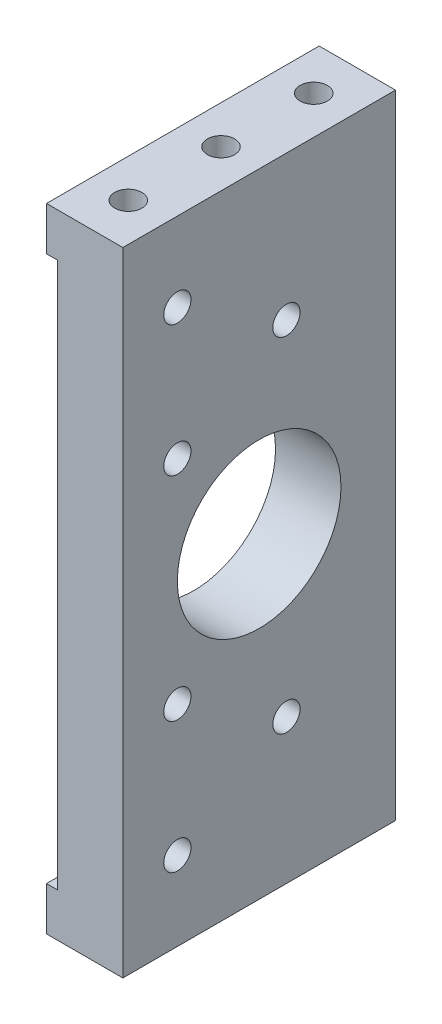
ISO-10303-21;
HEADER;
FILE_DESCRIPTION(('STEP AP214'),'2;1');
FILE_NAME('part.step','',(''),(''),'','','');
FILE_SCHEMA(('AUTOMOTIVE_DESIGN { 1 0 10303 214 1 1 1 1 }'));
ENDSEC;
DATA;
#1=APPLICATION_CONTEXT('core data for automotive mechanical design processes');
#2=APPLICATION_PROTOCOL_DEFINITION('international standard','automotive_design',2000,#1);
#3=PRODUCT_CONTEXT('',#1,'mechanical');
#4=PRODUCT('Part','Part','',(#3));
#5=PRODUCT_RELATED_PRODUCT_CATEGORY('part','',(#4));
#6=PRODUCT_DEFINITION_FORMATION('','',#4);
#7=PRODUCT_DEFINITION_CONTEXT('part definition',#1,'design');
#8=PRODUCT_DEFINITION('design','',#6,#7);
#9=PRODUCT_DEFINITION_SHAPE('','',#8);
#10=(LENGTH_UNIT() NAMED_UNIT(*) SI_UNIT(.MILLI.,.METRE.));
#11=(NAMED_UNIT(*) PLANE_ANGLE_UNIT() SI_UNIT($,.RADIAN.));
#12=(NAMED_UNIT(*) SI_UNIT($,.STERADIAN.) SOLID_ANGLE_UNIT());
#13=UNCERTAINTY_MEASURE_WITH_UNIT(LENGTH_MEASURE(1.E-05),#10,'distance_accuracy_value','');
#14=(GEOMETRIC_REPRESENTATION_CONTEXT(3) GLOBAL_UNCERTAINTY_ASSIGNED_CONTEXT((#13)) GLOBAL_UNIT_ASSIGNED_CONTEXT((#10,
#11,#12)) REPRESENTATION_CONTEXT('',''));
#15=CARTESIAN_POINT('',(0.,0.,0.));
#16=DIRECTION('',(0.,0.,1.));
#17=DIRECTION('',(1.,0.,0.));
#18=AXIS2_PLACEMENT_3D('',#15,#16,#17);
#19=CARTESIAN_POINT('',(0.,0.,25.));
#20=DIRECTION('',(0.,0.,-1.));
#21=DIRECTION('',(-1.,0.,0.));
#22=AXIS2_PLACEMENT_3D('',#19,#20,#21);
#23=PLANE('',#22);
#24=DIRECTION('',(0.,-1.,0.));
#25=VECTOR('',#24,1.);
#26=CARTESIAN_POINT('',(-86.,-29.,25.));
#27=LINE('',#26,#25);
#28=CARTESIAN_POINT('',(-86.,-25.,25.));
#29=VERTEX_POINT('',#28);
#30=CARTESIAN_POINT('',(-86.,-29.,25.));
#31=VERTEX_POINT('',#30);
#32=EDGE_CURVE('E245',#29,#31,#27,.T.);
#33=ORIENTED_EDGE('',*,*,#32,.T.);
#34=DIRECTION('',(-1.,0.,0.));
#35=VECTOR('',#34,1.);
#36=CARTESIAN_POINT('',(-79.,-29.,25.));
#37=LINE('',#36,#35);
#38=CARTESIAN_POINT('',(-79.,-29.,25.));
#39=VERTEX_POINT('',#38);
#40=EDGE_CURVE('E196',#39,#31,#37,.T.);
#41=ORIENTED_EDGE('',*,*,#40,.F.);
#42=DIRECTION('',(0.,1.,0.));
#43=VECTOR('',#42,1.);
#44=CARTESIAN_POINT('',(-79.,-29.,25.));
#45=LINE('',#44,#43);
#46=CARTESIAN_POINT('',(-79.,29.,25.));
#47=VERTEX_POINT('',#46);
#48=EDGE_CURVE('E211',#39,#47,#45,.T.);
#49=ORIENTED_EDGE('',*,*,#48,.T.);
#50=DIRECTION('',(-1.,0.,0.));
#51=VECTOR('',#50,1.);
#52=CARTESIAN_POINT('',(-86.,29.,25.));
#53=LINE('',#52,#51);
#54=CARTESIAN_POINT('',(-86.,29.,25.));
#55=VERTEX_POINT('',#54);
#56=EDGE_CURVE('E45',#47,#55,#53,.T.);
#57=ORIENTED_EDGE('',*,*,#56,.T.);
#58=CARTESIAN_POINT('',(-86.,25.,25.));
#59=VERTEX_POINT('',#58);
#60=EDGE_CURVE('E242',#55,#59,#27,.T.);
#61=ORIENTED_EDGE('',*,*,#60,.T.);
#62=DIRECTION('',(-1.,0.,0.));
#63=VECTOR('',#62,1.);
#64=CARTESIAN_POINT('',(-86.,25.,25.));
#65=LINE('',#64,#63);
#66=CARTESIAN_POINT('',(-85.,25.,25.));
#67=VERTEX_POINT('',#66);
#68=EDGE_CURVE('E221',#67,#59,#65,.T.);
#69=ORIENTED_EDGE('',*,*,#68,.F.);
#70=DIRECTION('',(0.,1.,0.));
#71=VECTOR('',#70,1.);
#72=CARTESIAN_POINT('',(-85.,25.,25.));
#73=LINE('',#72,#71);
#74=CARTESIAN_POINT('',(-85.,-25.,25.));
#75=VERTEX_POINT('',#74);
#76=EDGE_CURVE('E229',#75,#67,#73,.T.);
#77=ORIENTED_EDGE('',*,*,#76,.F.);
#78=DIRECTION('',(1.,0.,0.));
#79=VECTOR('',#78,1.);
#80=CARTESIAN_POINT('',(-86.,-25.,25.));
#81=LINE('',#80,#79);
#82=EDGE_CURVE('E216',#29,#75,#81,.T.);
#83=ORIENTED_EDGE('',*,*,#82,.F.);
#84=EDGE_LOOP('',(#33,#41,#49,#57,#61,#69,#77,#83));
#85=FACE_BOUND('',#84,.T.);
#86=ADVANCED_FACE('F36',(#85),#23,.F.);
#87=CARTESIAN_POINT('',(0.,0.,0.));
#88=DIRECTION('',(0.,0.,-1.));
#89=DIRECTION('',(-1.,0.,0.));
#90=AXIS2_PLACEMENT_3D('',#87,#88,#89);
#91=PLANE('',#90);
#92=DIRECTION('',(1.,0.,0.));
#93=VECTOR('',#92,1.);
#94=CARTESIAN_POINT('',(0.,-29.,0.));
#95=LINE('',#94,#93);
#96=CARTESIAN_POINT('',(-86.,-29.,0.));
#97=VERTEX_POINT('',#96);
#98=CARTESIAN_POINT('',(-79.,-29.,0.));
#99=VERTEX_POINT('',#98);
#100=EDGE_CURVE('E52',#97,#99,#95,.T.);
#101=ORIENTED_EDGE('',*,*,#100,.F.);
#102=DIRECTION('',(0.,-1.,0.));
#103=VECTOR('',#102,1.);
#104=CARTESIAN_POINT('',(-86.,-29.,0.));
#105=LINE('',#104,#103);
#106=CARTESIAN_POINT('',(-86.,-25.,0.));
#107=VERTEX_POINT('',#106);
#108=EDGE_CURVE('E236',#107,#97,#105,.T.);
#109=ORIENTED_EDGE('',*,*,#108,.F.);
#110=DIRECTION('',(1.,0.,0.));
#111=VECTOR('',#110,1.);
#112=CARTESIAN_POINT('',(-86.,-25.,0.));
#113=LINE('',#112,#111);
#114=CARTESIAN_POINT('',(-85.,-25.,0.));
#115=VERTEX_POINT('',#114);
#116=EDGE_CURVE('E218',#107,#115,#113,.T.);
#117=ORIENTED_EDGE('',*,*,#116,.T.);
#118=DIRECTION('',(0.,1.,0.));
#119=VECTOR('',#118,1.);
#120=CARTESIAN_POINT('',(-85.,25.,0.));
#121=LINE('',#120,#119);
#122=CARTESIAN_POINT('',(-85.,25.,0.));
#123=VERTEX_POINT('',#122);
#124=EDGE_CURVE('E60',#115,#123,#121,.T.);
#125=ORIENTED_EDGE('',*,*,#124,.T.);
#126=DIRECTION('',(-1.,0.,0.));
#127=VECTOR('',#126,1.);
#128=CARTESIAN_POINT('',(-86.,25.,0.));
#129=LINE('',#128,#127);
#130=CARTESIAN_POINT('',(-86.,25.,0.));
#131=VERTEX_POINT('',#130);
#132=EDGE_CURVE('E223',#123,#131,#129,.T.);
#133=ORIENTED_EDGE('',*,*,#132,.T.);
#134=CARTESIAN_POINT('',(-86.,29.,0.));
#135=VERTEX_POINT('',#134);
#136=EDGE_CURVE('E247',#135,#131,#105,.T.);
#137=ORIENTED_EDGE('',*,*,#136,.F.);
#138=DIRECTION('',(-1.,0.,0.));
#139=VECTOR('',#138,1.);
#140=CARTESIAN_POINT('',(-86.,29.,0.));
#141=LINE('',#140,#139);
#142=CARTESIAN_POINT('',(-79.,29.,0.));
#143=VERTEX_POINT('',#142);
#144=EDGE_CURVE('E250',#143,#135,#141,.T.);
#145=ORIENTED_EDGE('',*,*,#144,.F.);
#146=DIRECTION('',(0.,1.,0.));
#147=VECTOR('',#146,1.);
#148=CARTESIAN_POINT('',(-79.,-29.,0.));
#149=LINE('',#148,#147);
#150=EDGE_CURVE('E214',#99,#143,#149,.T.);
#151=ORIENTED_EDGE('',*,*,#150,.F.);
#152=EDGE_LOOP('',(#101,#109,#117,#125,#133,#137,#145,#151));
#153=FACE_BOUND('',#152,.T.);
#154=ADVANCED_FACE('F268',(#153),#91,.T.);
#155=CARTESIAN_POINT('',(-86.,-29.,25.));
#156=DIRECTION('',(1.,0.,0.));
#157=DIRECTION('',(0.,0.,-1.));
#158=AXIS2_PLACEMENT_3D('',#155,#156,#157);
#159=PLANE('',#158);
#160=ORIENTED_EDGE('',*,*,#136,.T.);
#161=DIRECTION('',(0.,0.,1.));
#162=VECTOR('',#161,1.);
#163=CARTESIAN_POINT('',(-86.,25.,0.));
#164=LINE('',#163,#162);
#165=EDGE_CURVE('E233',#131,#59,#164,.T.);
#166=ORIENTED_EDGE('',*,*,#165,.T.);
#167=ORIENTED_EDGE('',*,*,#60,.F.);
#168=DIRECTION('',(0.,0.,-1.));
#169=VECTOR('',#168,1.);
#170=CARTESIAN_POINT('',(-86.,29.,25.));
#171=LINE('',#170,#169);
#172=EDGE_CURVE('E11',#55,#135,#171,.T.);
#173=ORIENTED_EDGE('',*,*,#172,.T.);
#174=EDGE_LOOP('',(#160,#166,#167,#173));
#175=FACE_BOUND('',#174,.T.);
#176=ADVANCED_FACE('F278',(#175),#159,.F.);
#177=ORIENTED_EDGE('',*,*,#108,.T.);
#178=DIRECTION('',(0.,0.,1.));
#179=VECTOR('',#178,1.);
#180=CARTESIAN_POINT('',(-86.,-29.,-35.));
#181=LINE('',#180,#179);
#182=EDGE_CURVE('E198',#97,#31,#181,.T.);
#183=ORIENTED_EDGE('',*,*,#182,.T.);
#184=ORIENTED_EDGE('',*,*,#32,.F.);
#185=DIRECTION('',(0.,0.,1.));
#186=VECTOR('',#185,1.);
#187=CARTESIAN_POINT('',(-86.,-25.,0.));
#188=LINE('',#187,#186);
#189=EDGE_CURVE('E226',#107,#29,#188,.T.);
#190=ORIENTED_EDGE('',*,*,#189,.F.);
#191=EDGE_LOOP('',(#177,#183,#184,#190));
#192=FACE_BOUND('',#191,.T.);
#193=ADVANCED_FACE('F38',(#192),#159,.F.);
#194=CARTESIAN_POINT('',(-86.,29.,25.));
#195=DIRECTION('',(0.,-1.,0.));
#196=DIRECTION('',(1.,0.,0.));
#197=AXIS2_PLACEMENT_3D('',#194,#195,#196);
#198=PLANE('',#197);
#199=CARTESIAN_POINT('',(-82.5,29.,21.));
#200=DIRECTION('',(0.,1.,0.));
#201=DIRECTION('',(0.,0.,1.));
#202=AXIS2_PLACEMENT_3D('',#199,#200,#201);
#203=CIRCLE('',#202,1.24999999999999);
#204=CARTESIAN_POINT('',(-82.5,29.,22.25));
#205=VERTEX_POINT('',#204);
#206=EDGE_CURVE('E145',#205,#205,#203,.T.);
#207=ORIENTED_EDGE('',*,*,#206,.F.);
#208=EDGE_LOOP('',(#207));
#209=FACE_BOUND('',#208,.T.);
#210=CARTESIAN_POINT('',(-82.5,29.,12.5));
#211=DIRECTION('',(0.,1.,0.));
#212=DIRECTION('',(0.,0.,1.));
#213=AXIS2_PLACEMENT_3D('',#210,#211,#212);
#214=CIRCLE('',#213,1.24999999999999);
#215=CARTESIAN_POINT('',(-82.5,29.,13.75));
#216=VERTEX_POINT('',#215);
#217=EDGE_CURVE('E151',#216,#216,#214,.T.);
#218=ORIENTED_EDGE('',*,*,#217,.F.);
#219=EDGE_LOOP('',(#218));
#220=FACE_BOUND('',#219,.T.);
#221=CARTESIAN_POINT('',(-82.5,29.,4.));
#222=DIRECTION('',(0.,1.,0.));
#223=DIRECTION('',(0.,0.,1.));
#224=AXIS2_PLACEMENT_3D('',#221,#222,#223);
#225=CIRCLE('',#224,1.24999999999999);
#226=CARTESIAN_POINT('',(-82.5,29.,5.24999999999999));
#227=VERTEX_POINT('',#226);
#228=EDGE_CURVE('E157',#227,#227,#225,.T.);
#229=ORIENTED_EDGE('',*,*,#228,.F.);
#230=EDGE_LOOP('',(#229));
#231=FACE_BOUND('',#230,.T.);
#232=ORIENTED_EDGE('',*,*,#144,.T.);
#233=ORIENTED_EDGE('',*,*,#172,.F.);
#234=ORIENTED_EDGE('',*,*,#56,.F.);
#235=DIRECTION('',(0.,0.,-1.));
#236=VECTOR('',#235,1.);
#237=CARTESIAN_POINT('',(-79.,29.,30.3851648071345));
#238=LINE('',#237,#236);
#239=EDGE_CURVE('E206',#47,#143,#238,.T.);
#240=ORIENTED_EDGE('',*,*,#239,.T.);
#241=EDGE_LOOP('',(#232,#233,#234,#240));
#242=FACE_BOUND('',#241,.T.);
#243=ADVANCED_FACE('F275',(#209,#220,#231,#242),#198,.F.);
#244=CARTESIAN_POINT('',(-86.,25.,0.));
#245=DIRECTION('',(0.,1.,0.));
#246=DIRECTION('',(0.,0.,1.));
#247=AXIS2_PLACEMENT_3D('',#244,#245,#246);
#248=PLANE('',#247);
#249=ORIENTED_EDGE('',*,*,#68,.T.);
#250=ORIENTED_EDGE('',*,*,#165,.F.);
#251=ORIENTED_EDGE('',*,*,#132,.F.);
#252=DIRECTION('',(0.,0.,1.));
#253=VECTOR('',#252,1.);
#254=CARTESIAN_POINT('',(-85.,25.,0.));
#255=LINE('',#254,#253);
#256=EDGE_CURVE('E237',#123,#67,#255,.T.);
#257=ORIENTED_EDGE('',*,*,#256,.T.);
#258=EDGE_LOOP('',(#249,#250,#251,#257));
#259=FACE_BOUND('',#258,.T.);
#260=ADVANCED_FACE('F281',(#259),#248,.F.);
#261=CARTESIAN_POINT('',(-85.,25.,0.));
#262=DIRECTION('',(1.,0.,0.));
#263=DIRECTION('',(0.,0.,-1.));
#264=AXIS2_PLACEMENT_3D('',#261,#262,#263);
#265=PLANE('',#264);
#266=CARTESIAN_POINT('',(-85.,21.75,20.));
#267=DIRECTION('',(-1.,0.,0.));
#268=DIRECTION('',(0.,0.,1.));
#269=AXIS2_PLACEMENT_3D('',#266,#267,#268);
#270=CIRCLE('',#269,1.24999999999999);
#271=CARTESIAN_POINT('',(-85.,21.75,21.25));
#272=VERTEX_POINT('',#271);
#273=EDGE_CURVE('E163',#272,#272,#270,.T.);
#274=ORIENTED_EDGE('',*,*,#273,.F.);
#275=EDGE_LOOP('',(#274));
#276=FACE_BOUND('',#275,.T.);
#277=CARTESIAN_POINT('',(-85.,9.74999999999999,20.));
#278=DIRECTION('',(-1.,0.,0.));
#279=DIRECTION('',(0.,0.,1.));
#280=AXIS2_PLACEMENT_3D('',#277,#278,#279);
#281=CIRCLE('',#280,1.24999999999999);
#282=CARTESIAN_POINT('',(-85.,9.74999999999999,21.25));
#283=VERTEX_POINT('',#282);
#284=EDGE_CURVE('E169',#283,#283,#281,.T.);
#285=ORIENTED_EDGE('',*,*,#284,.F.);
#286=EDGE_LOOP('',(#285));
#287=FACE_BOUND('',#286,.T.);
#288=CARTESIAN_POINT('',(-85.,15.75,10.));
#289=DIRECTION('',(-1.,0.,0.));
#290=DIRECTION('',(0.,0.,1.));
#291=AXIS2_PLACEMENT_3D('',#288,#289,#290);
#292=CIRCLE('',#291,1.24999999999999);
#293=CARTESIAN_POINT('',(-85.,15.75,11.25));
#294=VERTEX_POINT('',#293);
#295=EDGE_CURVE('E175',#294,#294,#292,.T.);
#296=ORIENTED_EDGE('',*,*,#295,.F.);
#297=EDGE_LOOP('',(#296));
#298=FACE_BOUND('',#297,.T.);
#299=CARTESIAN_POINT('',(-85.,-9.75000000000001,20.));
#300=DIRECTION('',(-1.,0.,0.));
#301=DIRECTION('',(0.,0.,1.));
#302=AXIS2_PLACEMENT_3D('',#299,#300,#301);
#303=CIRCLE('',#302,1.24999999999999);
#304=CARTESIAN_POINT('',(-85.,-9.75000000000001,21.25));
#305=VERTEX_POINT('',#304);
#306=EDGE_CURVE('E181',#305,#305,#303,.T.);
#307=ORIENTED_EDGE('',*,*,#306,.F.);
#308=EDGE_LOOP('',(#307));
#309=FACE_BOUND('',#308,.T.);
#310=CARTESIAN_POINT('',(-85.,-21.75,20.));
#311=DIRECTION('',(-1.,0.,0.));
#312=DIRECTION('',(0.,0.,1.));
#313=AXIS2_PLACEMENT_3D('',#310,#311,#312);
#314=CIRCLE('',#313,1.24999999999999);
#315=CARTESIAN_POINT('',(-85.,-21.75,21.25));
#316=VERTEX_POINT('',#315);
#317=EDGE_CURVE('E184',#316,#316,#314,.T.);
#318=ORIENTED_EDGE('',*,*,#317,.F.);
#319=EDGE_LOOP('',(#318));
#320=FACE_BOUND('',#319,.T.);
#321=CARTESIAN_POINT('',(-85.,-15.75,10.));
#322=DIRECTION('',(-1.,0.,0.));
#323=DIRECTION('',(0.,0.,1.));
#324=AXIS2_PLACEMENT_3D('',#321,#322,#323);
#325=CIRCLE('',#324,1.24999999999999);
#326=CARTESIAN_POINT('',(-85.,-15.75,11.25));
#327=VERTEX_POINT('',#326);
#328=EDGE_CURVE('E190',#327,#327,#325,.T.);
#329=ORIENTED_EDGE('',*,*,#328,.F.);
#330=EDGE_LOOP('',(#329));
#331=FACE_BOUND('',#330,.T.);
#332=CARTESIAN_POINT('',(-85.,0.,12.5));
#333=DIRECTION('',(-1.,0.,0.));
#334=DIRECTION('',(0.,0.,1.));
#335=AXIS2_PLACEMENT_3D('',#332,#333,#334);
#336=CIRCLE('',#335,7.5);
#337=CARTESIAN_POINT('',(-85.,0.,20.));
#338=VERTEX_POINT('',#337);
#339=EDGE_CURVE('E203',#338,#338,#336,.T.);
#340=ORIENTED_EDGE('',*,*,#339,.F.);
#341=EDGE_LOOP('',(#340));
#342=FACE_BOUND('',#341,.T.);
#343=ORIENTED_EDGE('',*,*,#76,.T.);
#344=ORIENTED_EDGE('',*,*,#256,.F.);
#345=ORIENTED_EDGE('',*,*,#124,.F.);
#346=DIRECTION('',(0.,0.,1.));
#347=VECTOR('',#346,1.);
#348=CARTESIAN_POINT('',(-85.,-25.,0.));
#349=LINE('',#348,#347);
#350=EDGE_CURVE('E239',#115,#75,#349,.T.);
#351=ORIENTED_EDGE('',*,*,#350,.T.);
#352=EDGE_LOOP('',(#343,#344,#345,#351));
#353=FACE_BOUND('',#352,.T.);
#354=ADVANCED_FACE('F283',(#276,#287,#298,#309,#320,#331,#342,#353),#265,.F.);
#355=CARTESIAN_POINT('',(-86.,-25.,0.));
#356=DIRECTION('',(0.,-1.,0.));
#357=DIRECTION('',(0.,0.,-1.));
#358=AXIS2_PLACEMENT_3D('',#355,#356,#357);
#359=PLANE('',#358);
#360=ORIENTED_EDGE('',*,*,#82,.T.);
#361=ORIENTED_EDGE('',*,*,#350,.F.);
#362=ORIENTED_EDGE('',*,*,#116,.F.);
#363=ORIENTED_EDGE('',*,*,#189,.T.);
#364=EDGE_LOOP('',(#360,#361,#362,#363));
#365=FACE_BOUND('',#364,.T.);
#366=ADVANCED_FACE('F285',(#365),#359,.F.);
#367=CARTESIAN_POINT('',(-79.,-29.,-2.23606797749979));
#368=DIRECTION('',(1.,0.,0.));
#369=DIRECTION('',(0.,0.,-1.));
#370=AXIS2_PLACEMENT_3D('',#367,#368,#369);
#371=PLANE('',#370);
#372=CARTESIAN_POINT('',(-79.,21.75,20.));
#373=DIRECTION('',(1.,0.,0.));
#374=DIRECTION('',(0.,0.,-1.));
#375=AXIS2_PLACEMENT_3D('',#372,#373,#374);
#376=CIRCLE('',#375,1.24999999999999);
#377=CARTESIAN_POINT('',(-79.,21.75,18.75));
#378=VERTEX_POINT('',#377);
#379=EDGE_CURVE('E166',#378,#378,#376,.T.);
#380=ORIENTED_EDGE('',*,*,#379,.F.);
#381=EDGE_LOOP('',(#380));
#382=FACE_BOUND('',#381,.T.);
#383=CARTESIAN_POINT('',(-79.,9.74999999999999,20.));
#384=DIRECTION('',(1.,0.,0.));
#385=DIRECTION('',(0.,0.,-1.));
#386=AXIS2_PLACEMENT_3D('',#383,#384,#385);
#387=CIRCLE('',#386,1.24999999999999);
#388=CARTESIAN_POINT('',(-79.,9.74999999999999,18.75));
#389=VERTEX_POINT('',#388);
#390=EDGE_CURVE('E172',#389,#389,#387,.T.);
#391=ORIENTED_EDGE('',*,*,#390,.F.);
#392=EDGE_LOOP('',(#391));
#393=FACE_BOUND('',#392,.T.);
#394=CARTESIAN_POINT('',(-79.,15.75,10.));
#395=DIRECTION('',(1.,0.,0.));
#396=DIRECTION('',(0.,0.,-1.));
#397=AXIS2_PLACEMENT_3D('',#394,#395,#396);
#398=CIRCLE('',#397,1.24999999999999);
#399=CARTESIAN_POINT('',(-79.,15.75,8.75000000000002));
#400=VERTEX_POINT('',#399);
#401=EDGE_CURVE('E178',#400,#400,#398,.T.);
#402=ORIENTED_EDGE('',*,*,#401,.F.);
#403=EDGE_LOOP('',(#402));
#404=FACE_BOUND('',#403,.T.);
#405=CARTESIAN_POINT('',(-79.,-9.75000000000001,20.));
#406=DIRECTION('',(1.,0.,0.));
#407=DIRECTION('',(0.,0.,-1.));
#408=AXIS2_PLACEMENT_3D('',#405,#406,#407);
#409=CIRCLE('',#408,1.24999999999999);
#410=CARTESIAN_POINT('',(-79.,-9.75000000000001,18.75));
#411=VERTEX_POINT('',#410);
#412=EDGE_CURVE('E40',#411,#411,#409,.T.);
#413=ORIENTED_EDGE('',*,*,#412,.F.);
#414=EDGE_LOOP('',(#413));
#415=FACE_BOUND('',#414,.T.);
#416=CARTESIAN_POINT('',(-79.,-21.75,20.));
#417=DIRECTION('',(1.,0.,0.));
#418=DIRECTION('',(0.,0.,-1.));
#419=AXIS2_PLACEMENT_3D('',#416,#417,#418);
#420=CIRCLE('',#419,1.24999999999999);
#421=CARTESIAN_POINT('',(-79.,-21.75,18.75));
#422=VERTEX_POINT('',#421);
#423=EDGE_CURVE('E187',#422,#422,#420,.T.);
#424=ORIENTED_EDGE('',*,*,#423,.F.);
#425=EDGE_LOOP('',(#424));
#426=FACE_BOUND('',#425,.T.);
#427=CARTESIAN_POINT('',(-79.,-15.75,10.));
#428=DIRECTION('',(1.,0.,0.));
#429=DIRECTION('',(0.,0.,-1.));
#430=AXIS2_PLACEMENT_3D('',#427,#428,#429);
#431=CIRCLE('',#430,1.24999999999999);
#432=CARTESIAN_POINT('',(-79.,-15.75,8.75000000000002));
#433=VERTEX_POINT('',#432);
#434=EDGE_CURVE('E193',#433,#433,#431,.T.);
#435=ORIENTED_EDGE('',*,*,#434,.F.);
#436=EDGE_LOOP('',(#435));
#437=FACE_BOUND('',#436,.T.);
#438=ORIENTED_EDGE('',*,*,#239,.F.);
#439=ORIENTED_EDGE('',*,*,#48,.F.);
#440=DIRECTION('',(0.,0.,1.));
#441=VECTOR('',#440,1.);
#442=CARTESIAN_POINT('',(-79.,-29.,-2.23606797749979));
#443=LINE('',#442,#441);
#444=EDGE_CURVE('E213',#99,#39,#443,.T.);
#445=ORIENTED_EDGE('',*,*,#444,.F.);
#446=ORIENTED_EDGE('',*,*,#150,.T.);
#447=EDGE_LOOP('',(#438,#439,#445,#446));
#448=FACE_BOUND('',#447,.T.);
#449=CARTESIAN_POINT('',(-79.,0.,12.5));
#450=DIRECTION('',(1.,0.,0.));
#451=DIRECTION('',(0.,0.,-1.));
#452=AXIS2_PLACEMENT_3D('',#449,#450,#451);
#453=CIRCLE('',#452,7.5);
#454=CARTESIAN_POINT('',(-79.,0.,5.));
#455=VERTEX_POINT('',#454);
#456=EDGE_CURVE('E202',#455,#455,#453,.F.);
#457=ORIENTED_EDGE('',*,*,#456,.T.);
#458=EDGE_LOOP('',(#457));
#459=FACE_BOUND('',#458,.T.);
#460=ADVANCED_FACE('F272',(#382,#393,#404,#415,#426,#437,#448,#459),#371,.T.);
#461=CARTESIAN_POINT('',(86.001,0.,12.5));
#462=DIRECTION('',(-1.,0.,0.));
#463=DIRECTION('',(0.,0.,1.));
#464=AXIS2_PLACEMENT_3D('',#461,#462,#463);
#465=CYLINDRICAL_SURFACE('',#464,7.5);
#466=ORIENTED_EDGE('',*,*,#456,.F.);
#467=EDGE_LOOP('',(#466));
#468=FACE_BOUND('',#467,.T.);
#469=ORIENTED_EDGE('',*,*,#339,.T.);
#470=EDGE_LOOP('',(#469));
#471=FACE_BOUND('',#470,.T.);
#472=ADVANCED_FACE('F292',(#468,#471),#465,.F.);
#473=CARTESIAN_POINT('',(-79.,-29.,-35.));
#474=DIRECTION('',(0.,1.,0.));
#475=DIRECTION('',(0.,0.,1.));
#476=AXIS2_PLACEMENT_3D('',#473,#474,#475);
#477=PLANE('',#476);
#478=CARTESIAN_POINT('',(-82.5,-29.0000000000001,21.));
#479=DIRECTION('',(0.,-1.,0.));
#480=DIRECTION('',(0.,0.,-1.));
#481=AXIS2_PLACEMENT_3D('',#478,#479,#480);
#482=CIRCLE('',#481,1.24999999999999);
#483=CARTESIAN_POINT('',(-82.5,-29.0000000000001,19.75));
#484=VERTEX_POINT('',#483);
#485=EDGE_CURVE('E129',#484,#484,#482,.T.);
#486=ORIENTED_EDGE('',*,*,#485,.F.);
#487=EDGE_LOOP('',(#486));
#488=FACE_BOUND('',#487,.T.);
#489=CARTESIAN_POINT('',(-82.5,-29.0000000000001,12.5));
#490=DIRECTION('',(0.,-1.,0.));
#491=DIRECTION('',(0.,0.,-1.));
#492=AXIS2_PLACEMENT_3D('',#489,#490,#491);
#493=CIRCLE('',#492,1.24999999999999);
#494=CARTESIAN_POINT('',(-82.5,-29.0000000000001,11.25));
#495=VERTEX_POINT('',#494);
#496=EDGE_CURVE('E128',#495,#495,#493,.T.);
#497=ORIENTED_EDGE('',*,*,#496,.F.);
#498=EDGE_LOOP('',(#497));
#499=FACE_BOUND('',#498,.T.);
#500=CARTESIAN_POINT('',(-82.5,-29.0000000000001,4.));
#501=DIRECTION('',(0.,-1.,0.));
#502=DIRECTION('',(0.,0.,-1.));
#503=AXIS2_PLACEMENT_3D('',#500,#501,#502);
#504=CIRCLE('',#503,1.24999999999999);
#505=CARTESIAN_POINT('',(-82.5,-29.0000000000001,2.75000000000001));
#506=VERTEX_POINT('',#505);
#507=EDGE_CURVE('E139',#506,#506,#504,.T.);
#508=ORIENTED_EDGE('',*,*,#507,.F.);
#509=EDGE_LOOP('',(#508));
#510=FACE_BOUND('',#509,.T.);
#511=ORIENTED_EDGE('',*,*,#100,.T.);
#512=ORIENTED_EDGE('',*,*,#444,.T.);
#513=ORIENTED_EDGE('',*,*,#40,.T.);
#514=ORIENTED_EDGE('',*,*,#182,.F.);
#515=EDGE_LOOP('',(#511,#512,#513,#514));
#516=FACE_BOUND('',#515,.T.);
#517=ADVANCED_FACE('F266',(#488,#499,#510,#516),#477,.F.);
#518=CARTESIAN_POINT('',(-85.,-15.75,10.));
#519=DIRECTION('',(-1.,0.,0.));
#520=DIRECTION('',(0.,0.,1.));
#521=AXIS2_PLACEMENT_3D('',#518,#519,#520);
#522=CYLINDRICAL_SURFACE('',#521,1.24999999999999);
#523=ORIENTED_EDGE('',*,*,#434,.T.);
#524=EDGE_LOOP('',(#523));
#525=FACE_BOUND('',#524,.T.);
#526=ORIENTED_EDGE('',*,*,#328,.T.);
#527=EDGE_LOOP('',(#526));
#528=FACE_BOUND('',#527,.T.);
#529=ADVANCED_FACE('F353',(#525,#528),#522,.F.);
#530=CARTESIAN_POINT('',(-85.,-21.75,20.));
#531=DIRECTION('',(-1.,0.,0.));
#532=DIRECTION('',(0.,0.,1.));
#533=AXIS2_PLACEMENT_3D('',#530,#531,#532);
#534=CYLINDRICAL_SURFACE('',#533,1.24999999999999);
#535=ORIENTED_EDGE('',*,*,#423,.T.);
#536=EDGE_LOOP('',(#535));
#537=FACE_BOUND('',#536,.T.);
#538=ORIENTED_EDGE('',*,*,#317,.T.);
#539=EDGE_LOOP('',(#538));
#540=FACE_BOUND('',#539,.T.);
#541=ADVANCED_FACE('F349',(#537,#540),#534,.F.);
#542=CARTESIAN_POINT('',(-85.,-9.75000000000001,20.));
#543=DIRECTION('',(-1.,0.,0.));
#544=DIRECTION('',(0.,0.,1.));
#545=AXIS2_PLACEMENT_3D('',#542,#543,#544);
#546=CYLINDRICAL_SURFACE('',#545,1.24999999999999);
#547=ORIENTED_EDGE('',*,*,#412,.T.);
#548=EDGE_LOOP('',(#547));
#549=FACE_BOUND('',#548,.T.);
#550=ORIENTED_EDGE('',*,*,#306,.T.);
#551=EDGE_LOOP('',(#550));
#552=FACE_BOUND('',#551,.T.);
#553=ADVANCED_FACE('F345',(#549,#552),#546,.F.);
#554=CARTESIAN_POINT('',(-85.,15.75,10.));
#555=DIRECTION('',(-1.,0.,0.));
#556=DIRECTION('',(0.,0.,1.));
#557=AXIS2_PLACEMENT_3D('',#554,#555,#556);
#558=CYLINDRICAL_SURFACE('',#557,1.24999999999999);
#559=ORIENTED_EDGE('',*,*,#401,.T.);
#560=EDGE_LOOP('',(#559));
#561=FACE_BOUND('',#560,.T.);
#562=ORIENTED_EDGE('',*,*,#295,.T.);
#563=EDGE_LOOP('',(#562));
#564=FACE_BOUND('',#563,.T.);
#565=ADVANCED_FACE('F341',(#561,#564),#558,.F.);
#566=CARTESIAN_POINT('',(-85.,9.74999999999999,20.));
#567=DIRECTION('',(-1.,0.,0.));
#568=DIRECTION('',(0.,0.,1.));
#569=AXIS2_PLACEMENT_3D('',#566,#567,#568);
#570=CYLINDRICAL_SURFACE('',#569,1.24999999999999);
#571=ORIENTED_EDGE('',*,*,#390,.T.);
#572=EDGE_LOOP('',(#571));
#573=FACE_BOUND('',#572,.T.);
#574=ORIENTED_EDGE('',*,*,#284,.T.);
#575=EDGE_LOOP('',(#574));
#576=FACE_BOUND('',#575,.T.);
#577=ADVANCED_FACE('F337',(#573,#576),#570,.F.);
#578=CARTESIAN_POINT('',(-85.,21.75,20.));
#579=DIRECTION('',(-1.,0.,0.));
#580=DIRECTION('',(0.,0.,1.));
#581=AXIS2_PLACEMENT_3D('',#578,#579,#580);
#582=CYLINDRICAL_SURFACE('',#581,1.24999999999999);
#583=ORIENTED_EDGE('',*,*,#379,.T.);
#584=EDGE_LOOP('',(#583));
#585=FACE_BOUND('',#584,.T.);
#586=ORIENTED_EDGE('',*,*,#273,.T.);
#587=EDGE_LOOP('',(#586));
#588=FACE_BOUND('',#587,.T.);
#589=ADVANCED_FACE('F329',(#585,#588),#582,.F.);
#590=CARTESIAN_POINT('',(-82.5,24.,4.));
#591=DIRECTION('',(0.,1.,0.));
#592=DIRECTION('',(0.,0.,1.));
#593=AXIS2_PLACEMENT_3D('',#590,#591,#592);
#594=CONICAL_SURFACE('',#593,1.25,1.02974425867666);
#595=CARTESIAN_POINT('',(-82.5,23.2489242262155,4.));
#596=VERTEX_POINT('',#595);
#597=VERTEX_LOOP('',#596);
#598=FACE_BOUND('',#597,.T.);
#599=CARTESIAN_POINT('',(-82.5,24.,4.));
#600=DIRECTION('',(0.,1.,0.));
#601=DIRECTION('',(0.,0.,1.));
#602=AXIS2_PLACEMENT_3D('',#599,#600,#601);
#603=CIRCLE('',#602,1.25);
#604=CARTESIAN_POINT('',(-82.5,24.,5.25));
#605=VERTEX_POINT('',#604);
#606=EDGE_CURVE('E160',#605,#605,#603,.T.);
#607=ORIENTED_EDGE('',*,*,#606,.T.);
#608=EDGE_LOOP('',(#607));
#609=FACE_BOUND('',#608,.T.);
#610=ADVANCED_FACE('F319',(#598,#609),#594,.F.);
#611=CARTESIAN_POINT('',(-82.5,29.,4.));
#612=DIRECTION('',(0.,1.,0.));
#613=DIRECTION('',(0.,0.,1.));
#614=AXIS2_PLACEMENT_3D('',#611,#612,#613);
#615=CYLINDRICAL_SURFACE('',#614,1.24999999999999);
#616=ORIENTED_EDGE('',*,*,#606,.F.);
#617=EDGE_LOOP('',(#616));
#618=FACE_BOUND('',#617,.T.);
#619=ORIENTED_EDGE('',*,*,#228,.T.);
#620=EDGE_LOOP('',(#619));
#621=FACE_BOUND('',#620,.T.);
#622=ADVANCED_FACE('F316',(#618,#621),#615,.F.);
#623=CARTESIAN_POINT('',(-82.5,24.,12.5));
#624=DIRECTION('',(0.,1.,0.));
#625=DIRECTION('',(0.,0.,1.));
#626=AXIS2_PLACEMENT_3D('',#623,#624,#625);
#627=CONICAL_SURFACE('',#626,1.25,1.02974425867666);
#628=CARTESIAN_POINT('',(-82.5,23.2489242262155,12.5));
#629=VERTEX_POINT('',#628);
#630=VERTEX_LOOP('',#629);
#631=FACE_BOUND('',#630,.T.);
#632=CARTESIAN_POINT('',(-82.5,24.,12.5));
#633=DIRECTION('',(0.,1.,0.));
#634=DIRECTION('',(0.,0.,1.));
#635=AXIS2_PLACEMENT_3D('',#632,#633,#634);
#636=CIRCLE('',#635,1.25);
#637=CARTESIAN_POINT('',(-82.5,24.,13.75));
#638=VERTEX_POINT('',#637);
#639=EDGE_CURVE('E154',#638,#638,#636,.T.);
#640=ORIENTED_EDGE('',*,*,#639,.T.);
#641=EDGE_LOOP('',(#640));
#642=FACE_BOUND('',#641,.T.);
#643=ADVANCED_FACE('F318',(#631,#642),#627,.F.);
#644=CARTESIAN_POINT('',(-82.5,29.,12.5));
#645=DIRECTION('',(0.,1.,0.));
#646=DIRECTION('',(0.,0.,1.));
#647=AXIS2_PLACEMENT_3D('',#644,#645,#646);
#648=CYLINDRICAL_SURFACE('',#647,1.24999999999999);
#649=ORIENTED_EDGE('',*,*,#639,.F.);
#650=EDGE_LOOP('',(#649));
#651=FACE_BOUND('',#650,.T.);
#652=ORIENTED_EDGE('',*,*,#217,.T.);
#653=EDGE_LOOP('',(#652));
#654=FACE_BOUND('',#653,.T.);
#655=ADVANCED_FACE('F326',(#651,#654),#648,.F.);
#656=CARTESIAN_POINT('',(-82.5,24.,21.));
#657=DIRECTION('',(0.,1.,0.));
#658=DIRECTION('',(0.,0.,1.));
#659=AXIS2_PLACEMENT_3D('',#656,#657,#658);
#660=CONICAL_SURFACE('',#659,1.25,1.02974425867666);
#661=CARTESIAN_POINT('',(-82.5,23.2489242262155,21.));
#662=VERTEX_POINT('',#661);
#663=VERTEX_LOOP('',#662);
#664=FACE_BOUND('',#663,.T.);
#665=CARTESIAN_POINT('',(-82.5,24.,21.));
#666=DIRECTION('',(0.,1.,0.));
#667=DIRECTION('',(0.,0.,1.));
#668=AXIS2_PLACEMENT_3D('',#665,#666,#667);
#669=CIRCLE('',#668,1.25);
#670=CARTESIAN_POINT('',(-82.5,24.,22.25));
#671=VERTEX_POINT('',#670);
#672=EDGE_CURVE('E148',#671,#671,#669,.T.);
#673=ORIENTED_EDGE('',*,*,#672,.T.);
#674=EDGE_LOOP('',(#673));
#675=FACE_BOUND('',#674,.T.);
#676=ADVANCED_FACE('F430',(#664,#675),#660,.F.);
#677=CARTESIAN_POINT('',(-82.5,29.,21.));
#678=DIRECTION('',(0.,1.,0.));
#679=DIRECTION('',(0.,0.,1.));
#680=AXIS2_PLACEMENT_3D('',#677,#678,#679);
#681=CYLINDRICAL_SURFACE('',#680,1.24999999999999);
#682=ORIENTED_EDGE('',*,*,#672,.F.);
#683=EDGE_LOOP('',(#682));
#684=FACE_BOUND('',#683,.T.);
#685=ORIENTED_EDGE('',*,*,#206,.T.);
#686=EDGE_LOOP('',(#685));
#687=FACE_BOUND('',#686,.T.);
#688=ADVANCED_FACE('F439',(#684,#687),#681,.F.);
#689=CARTESIAN_POINT('',(-82.5,-24.0000000000001,4.));
#690=DIRECTION('',(0.,-1.,0.));
#691=DIRECTION('',(0.,0.,-1.));
#692=AXIS2_PLACEMENT_3D('',#689,#690,#691);
#693=CONICAL_SURFACE('',#692,1.25,1.02974425867666);
#694=CARTESIAN_POINT('',(-82.5,-23.2489242262156,4.));
#695=VERTEX_POINT('',#694);
#696=VERTEX_LOOP('',#695);
#697=FACE_BOUND('',#696,.T.);
#698=CARTESIAN_POINT('',(-82.5,-24.0000000000001,4.));
#699=DIRECTION('',(0.,-1.,0.));
#700=DIRECTION('',(0.,0.,-1.));
#701=AXIS2_PLACEMENT_3D('',#698,#699,#700);
#702=CIRCLE('',#701,1.25);
#703=CARTESIAN_POINT('',(-82.5,-24.0000000000001,2.75));
#704=VERTEX_POINT('',#703);
#705=EDGE_CURVE('E142',#704,#704,#702,.T.);
#706=ORIENTED_EDGE('',*,*,#705,.T.);
#707=EDGE_LOOP('',(#706));
#708=FACE_BOUND('',#707,.T.);
#709=ADVANCED_FACE('F448',(#697,#708),#693,.F.);
#710=CARTESIAN_POINT('',(-82.5,-29.0000000000001,4.));
#711=DIRECTION('',(0.,-1.,0.));
#712=DIRECTION('',(0.,0.,-1.));
#713=AXIS2_PLACEMENT_3D('',#710,#711,#712);
#714=CYLINDRICAL_SURFACE('',#713,1.24999999999999);
#715=ORIENTED_EDGE('',*,*,#705,.F.);
#716=EDGE_LOOP('',(#715));
#717=FACE_BOUND('',#716,.T.);
#718=ORIENTED_EDGE('',*,*,#507,.T.);
#719=EDGE_LOOP('',(#718));
#720=FACE_BOUND('',#719,.T.);
#721=ADVANCED_FACE('F458',(#717,#720),#714,.F.);
#722=CARTESIAN_POINT('',(-82.5,-24.0000000000001,12.5));
#723=DIRECTION('',(0.,-1.,0.));
#724=DIRECTION('',(0.,0.,-1.));
#725=AXIS2_PLACEMENT_3D('',#722,#723,#724);
#726=CONICAL_SURFACE('',#725,1.25,1.02974425867666);
#727=CARTESIAN_POINT('',(-82.5,-23.2489242262156,12.5));
#728=VERTEX_POINT('',#727);
#729=VERTEX_LOOP('',#728);
#730=FACE_BOUND('',#729,.T.);
#731=CARTESIAN_POINT('',(-82.5,-24.0000000000001,12.5));
#732=DIRECTION('',(0.,-1.,0.));
#733=DIRECTION('',(0.,0.,-1.));
#734=AXIS2_PLACEMENT_3D('',#731,#732,#733);
#735=CIRCLE('',#734,1.25);
#736=CARTESIAN_POINT('',(-82.5,-24.0000000000001,11.25));
#737=VERTEX_POINT('',#736);
#738=EDGE_CURVE('E132',#737,#737,#735,.T.);
#739=ORIENTED_EDGE('',*,*,#738,.T.);
#740=EDGE_LOOP('',(#739));
#741=FACE_BOUND('',#740,.T.);
#742=ADVANCED_FACE('F463',(#730,#741),#726,.F.);
#743=CARTESIAN_POINT('',(-82.5,-29.0000000000001,12.5));
#744=DIRECTION('',(0.,-1.,0.));
#745=DIRECTION('',(0.,0.,-1.));
#746=AXIS2_PLACEMENT_3D('',#743,#744,#745);
#747=CYLINDRICAL_SURFACE('',#746,1.24999999999999);
#748=ORIENTED_EDGE('',*,*,#738,.F.);
#749=EDGE_LOOP('',(#748));
#750=FACE_BOUND('',#749,.T.);
#751=ORIENTED_EDGE('',*,*,#496,.T.);
#752=EDGE_LOOP('',(#751));
#753=FACE_BOUND('',#752,.T.);
#754=ADVANCED_FACE('F122',(#750,#753),#747,.F.);
#755=CARTESIAN_POINT('',(-82.5,-24.0000000000001,21.));
#756=DIRECTION('',(0.,-1.,0.));
#757=DIRECTION('',(0.,0.,-1.));
#758=AXIS2_PLACEMENT_3D('',#755,#756,#757);
#759=CONICAL_SURFACE('',#758,1.25,1.02974425867666);
#760=CARTESIAN_POINT('',(-82.5,-23.2489242262156,21.));
#761=VERTEX_POINT('',#760);
#762=VERTEX_LOOP('',#761);
#763=FACE_BOUND('',#762,.T.);
#764=CARTESIAN_POINT('',(-82.5,-24.0000000000001,21.));
#765=DIRECTION('',(0.,-1.,0.));
#766=DIRECTION('',(0.,0.,-1.));
#767=AXIS2_PLACEMENT_3D('',#764,#765,#766);
#768=CIRCLE('',#767,1.25);
#769=CARTESIAN_POINT('',(-82.5,-24.0000000000001,19.75));
#770=VERTEX_POINT('',#769);
#771=EDGE_CURVE('E126',#770,#770,#768,.T.);
#772=ORIENTED_EDGE('',*,*,#771,.T.);
#773=EDGE_LOOP('',(#772));
#774=FACE_BOUND('',#773,.T.);
#775=ADVANCED_FACE('F118',(#763,#774),#759,.F.);
#776=CARTESIAN_POINT('',(-82.5,-29.0000000000001,21.));
#777=DIRECTION('',(0.,-1.,0.));
#778=DIRECTION('',(0.,0.,-1.));
#779=AXIS2_PLACEMENT_3D('',#776,#777,#778);
#780=CYLINDRICAL_SURFACE('',#779,1.24999999999999);
#781=ORIENTED_EDGE('',*,*,#771,.F.);
#782=EDGE_LOOP('',(#781));
#783=FACE_BOUND('',#782,.T.);
#784=ORIENTED_EDGE('',*,*,#485,.T.);
#785=EDGE_LOOP('',(#784));
#786=FACE_BOUND('',#785,.T.);
#787=ADVANCED_FACE('F121',(#783,#786),#780,.F.);
#788=CLOSED_SHELL('',(#86,#154,#176,#193,#243,#260,#354,#366,#460,#472,#517,#529,#541,#553,#565,
#577,#589,#610,#622,#643,#655,#676,#688,#709,#721,#742,#754,#775,#787));
#789=MANIFOLD_SOLID_BREP('B2',#788);
#790=ADVANCED_BREP_SHAPE_REPRESENTATION('',(#18,#789),#14);
#791=SHAPE_DEFINITION_REPRESENTATION(#9,#790);
ENDSEC;
END-ISO-10303-21;
